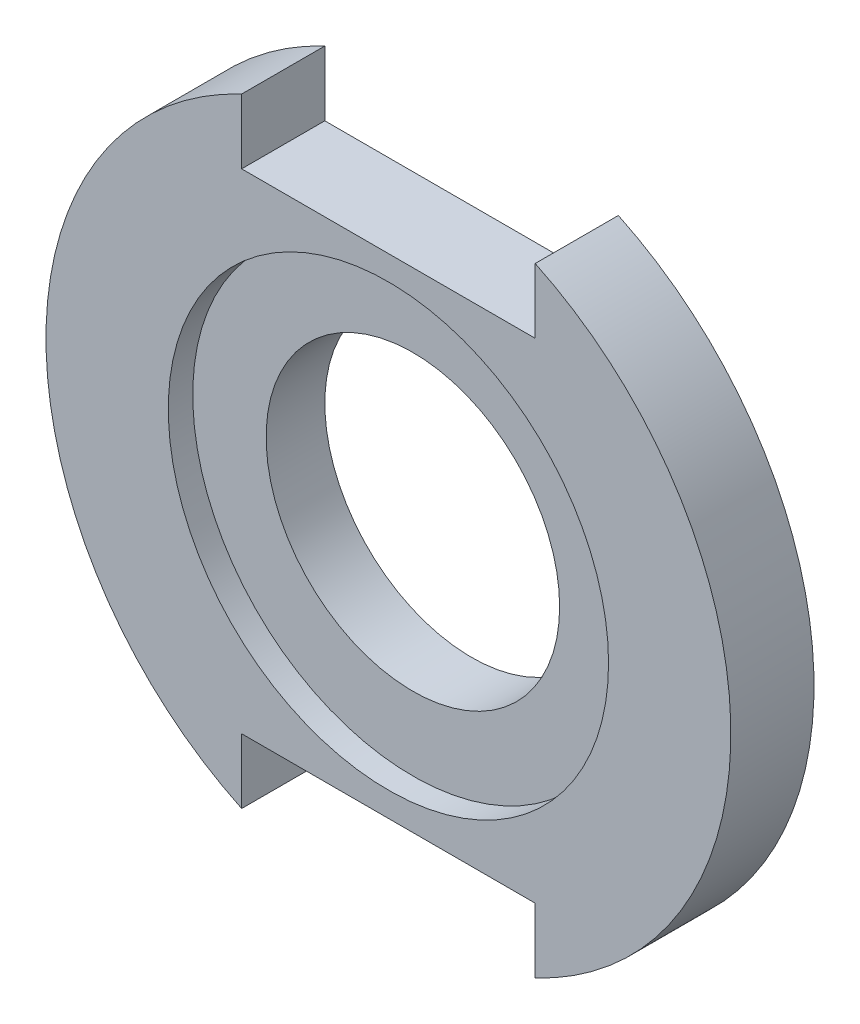
ISO-10303-21;
HEADER;
FILE_DESCRIPTION(('STEP AP214'),'2;1');
FILE_NAME('part.step','',(''),(''),'','','');
FILE_SCHEMA(('AUTOMOTIVE_DESIGN { 1 0 10303 214 1 1 1 1 }'));
ENDSEC;
DATA;
#1=APPLICATION_CONTEXT('core data for automotive mechanical design processes');
#2=APPLICATION_PROTOCOL_DEFINITION('international standard','automotive_design',2000,#1);
#3=PRODUCT_CONTEXT('',#1,'mechanical');
#4=PRODUCT('Part','Part','',(#3));
#5=PRODUCT_RELATED_PRODUCT_CATEGORY('part','',(#4));
#6=PRODUCT_DEFINITION_FORMATION('','',#4);
#7=PRODUCT_DEFINITION_CONTEXT('part definition',#1,'design');
#8=PRODUCT_DEFINITION('design','',#6,#7);
#9=PRODUCT_DEFINITION_SHAPE('','',#8);
#10=(LENGTH_UNIT() NAMED_UNIT(*) SI_UNIT(.MILLI.,.METRE.));
#11=(NAMED_UNIT(*) PLANE_ANGLE_UNIT() SI_UNIT($,.RADIAN.));
#12=(NAMED_UNIT(*) SI_UNIT($,.STERADIAN.) SOLID_ANGLE_UNIT());
#13=UNCERTAINTY_MEASURE_WITH_UNIT(LENGTH_MEASURE(1.E-05),#10,'distance_accuracy_value','');
#14=(GEOMETRIC_REPRESENTATION_CONTEXT(3) GLOBAL_UNCERTAINTY_ASSIGNED_CONTEXT((#13)) GLOBAL_UNIT_ASSIGNED_CONTEXT((#10,
#11,#12)) REPRESENTATION_CONTEXT('',''));
#15=CARTESIAN_POINT('',(0.,0.,0.));
#16=DIRECTION('',(0.,0.,1.));
#17=DIRECTION('',(1.,0.,0.));
#18=AXIS2_PLACEMENT_3D('',#15,#16,#17);
#19=CARTESIAN_POINT('',(0.,0.,0.));
#20=DIRECTION('',(0.,0.,1.));
#21=DIRECTION('',(1.,0.,0.));
#22=AXIS2_PLACEMENT_3D('',#19,#20,#21);
#23=CYLINDRICAL_SURFACE('',#22,6.);
#24=CARTESIAN_POINT('',(0.,0.,0.));
#25=DIRECTION('',(0.,0.,1.));
#26=DIRECTION('',(1.,0.,0.));
#27=AXIS2_PLACEMENT_3D('',#24,#25,#26);
#28=CIRCLE('',#27,6.);
#29=CARTESIAN_POINT('',(6.,0.,0.));
#30=VERTEX_POINT('',#29);
#31=EDGE_CURVE('E161',#30,#30,#28,.T.);
#32=ORIENTED_EDGE('',*,*,#31,.F.);
#33=EDGE_LOOP('',(#32));
#34=FACE_BOUND('',#33,.T.);
#35=CARTESIAN_POINT('',(0.,0.,2.4));
#36=DIRECTION('',(0.,0.,1.));
#37=DIRECTION('',(1.,0.,0.));
#38=AXIS2_PLACEMENT_3D('',#35,#36,#37);
#39=CIRCLE('',#38,6.);
#40=CARTESIAN_POINT('',(6.,0.,2.4));
#41=VERTEX_POINT('',#40);
#42=EDGE_CURVE('E44',#41,#41,#39,.F.);
#43=ORIENTED_EDGE('',*,*,#42,.F.);
#44=EDGE_LOOP('',(#43));
#45=FACE_BOUND('',#44,.T.);
#46=ADVANCED_FACE('F40',(#34,#45),#23,.F.);
#47=CARTESIAN_POINT('',(0.,0.,3.4));
#48=DIRECTION('',(0.,0.,-1.));
#49=DIRECTION('',(-1.,0.,0.));
#50=AXIS2_PLACEMENT_3D('',#47,#48,#49);
#51=CYLINDRICAL_SURFACE('',#50,14.);
#52=CARTESIAN_POINT('',(0.,0.,0.));
#53=DIRECTION('',(0.,0.,1.));
#54=DIRECTION('',(1.,0.,0.));
#55=AXIS2_PLACEMENT_3D('',#52,#53,#54);
#56=CIRCLE('',#55,14.);
#57=CARTESIAN_POINT('',(6.,-12.6491106406735,0.));
#58=VERTEX_POINT('',#57);
#59=CARTESIAN_POINT('',(6.,12.6491106406735,0.));
#60=VERTEX_POINT('',#59);
#61=EDGE_CURVE('E164',#58,#60,#56,.T.);
#62=ORIENTED_EDGE('',*,*,#61,.T.);
#63=DIRECTION('',(0.,0.,-1.));
#64=VECTOR('',#63,1.);
#65=CARTESIAN_POINT('',(6.,12.6491106406735,3.4));
#66=LINE('',#65,#64);
#67=CARTESIAN_POINT('',(6.,12.6491106406735,3.4));
#68=VERTEX_POINT('',#67);
#69=EDGE_CURVE('E119',#60,#68,#66,.F.);
#70=ORIENTED_EDGE('',*,*,#69,.T.);
#71=CARTESIAN_POINT('',(0.,0.,3.4));
#72=DIRECTION('',(0.,0.,1.));
#73=DIRECTION('',(1.,0.,0.));
#74=AXIS2_PLACEMENT_3D('',#71,#72,#73);
#75=CIRCLE('',#74,14.);
#76=CARTESIAN_POINT('',(6.,-12.6491106406735,3.4));
#77=VERTEX_POINT('',#76);
#78=EDGE_CURVE('E165',#77,#68,#75,.T.);
#79=ORIENTED_EDGE('',*,*,#78,.F.);
#80=DIRECTION('',(0.,0.,-1.));
#81=VECTOR('',#80,1.);
#82=CARTESIAN_POINT('',(6.,-12.6491106406735,3.4));
#83=LINE('',#82,#81);
#84=EDGE_CURVE('E154',#77,#58,#83,.T.);
#85=ORIENTED_EDGE('',*,*,#84,.T.);
#86=EDGE_LOOP('',(#62,#70,#79,#85));
#87=FACE_BOUND('',#86,.T.);
#88=ADVANCED_FACE('F189',(#87),#51,.T.);
#89=CARTESIAN_POINT('',(-6.,12.6491106406735,3.4));
#90=VERTEX_POINT('',#89);
#91=CARTESIAN_POINT('',(-6.,-12.6491106406735,3.4));
#92=VERTEX_POINT('',#91);
#93=EDGE_CURVE('E168',#90,#92,#75,.T.);
#94=ORIENTED_EDGE('',*,*,#93,.F.);
#95=DIRECTION('',(0.,0.,-1.));
#96=VECTOR('',#95,1.);
#97=CARTESIAN_POINT('',(-6.,12.6491106406735,3.4));
#98=LINE('',#97,#96);
#99=CARTESIAN_POINT('',(-6.,12.6491106406735,0.));
#100=VERTEX_POINT('',#99);
#101=EDGE_CURVE('E157',#90,#100,#98,.T.);
#102=ORIENTED_EDGE('',*,*,#101,.T.);
#103=CARTESIAN_POINT('',(-6.,-12.6491106406735,0.));
#104=VERTEX_POINT('',#103);
#105=EDGE_CURVE('E169',#100,#104,#56,.T.);
#106=ORIENTED_EDGE('',*,*,#105,.T.);
#107=DIRECTION('',(0.,0.,-1.));
#108=VECTOR('',#107,1.);
#109=CARTESIAN_POINT('',(-6.,-12.6491106406735,3.4));
#110=LINE('',#109,#108);
#111=EDGE_CURVE('E112',#104,#92,#110,.F.);
#112=ORIENTED_EDGE('',*,*,#111,.T.);
#113=EDGE_LOOP('',(#94,#102,#106,#112));
#114=FACE_BOUND('',#113,.T.);
#115=ADVANCED_FACE('F42',(#114),#51,.T.);
#116=CARTESIAN_POINT('',(0.,0.,3.4));
#117=DIRECTION('',(0.,0.,1.));
#118=DIRECTION('',(1.,0.,0.));
#119=AXIS2_PLACEMENT_3D('',#116,#117,#118);
#120=PLANE('',#119);
#121=CARTESIAN_POINT('',(0.,0.,3.4));
#122=DIRECTION('',(0.,0.,1.));
#123=DIRECTION('',(1.,0.,0.));
#124=AXIS2_PLACEMENT_3D('',#121,#122,#123);
#125=CIRCLE('',#124,9.);
#126=CARTESIAN_POINT('',(9.,0.,3.4));
#127=VERTEX_POINT('',#126);
#128=EDGE_CURVE('E218',#127,#127,#125,.T.);
#129=ORIENTED_EDGE('',*,*,#128,.F.);
#130=EDGE_LOOP('',(#129));
#131=FACE_BOUND('',#130,.T.);
#132=DIRECTION('',(0.,1.,0.));
#133=VECTOR('',#132,1.);
#134=CARTESIAN_POINT('',(6.,18.,3.4));
#135=LINE('',#134,#133);
#136=CARTESIAN_POINT('',(6.,10.,3.4));
#137=VERTEX_POINT('',#136);
#138=EDGE_CURVE('E131',#137,#68,#135,.T.);
#139=ORIENTED_EDGE('',*,*,#138,.F.);
#140=DIRECTION('',(1.,0.,0.));
#141=VECTOR('',#140,1.);
#142=CARTESIAN_POINT('',(-6.,10.,3.4));
#143=LINE('',#142,#141);
#144=CARTESIAN_POINT('',(-6.,10.,3.4));
#145=VERTEX_POINT('',#144);
#146=EDGE_CURVE('E109',#145,#137,#143,.T.);
#147=ORIENTED_EDGE('',*,*,#146,.F.);
#148=DIRECTION('',(0.,-1.,0.));
#149=VECTOR('',#148,1.);
#150=CARTESIAN_POINT('',(-6.,18.,3.4));
#151=LINE('',#150,#149);
#152=EDGE_CURVE('E133',#90,#145,#151,.T.);
#153=ORIENTED_EDGE('',*,*,#152,.F.);
#154=ORIENTED_EDGE('',*,*,#93,.T.);
#155=DIRECTION('',(0.,-1.,0.));
#156=VECTOR('',#155,1.);
#157=CARTESIAN_POINT('',(-6.,-18.,3.4));
#158=LINE('',#157,#156);
#159=CARTESIAN_POINT('',(-6.,-10.,3.4));
#160=VERTEX_POINT('',#159);
#161=EDGE_CURVE('E142',#160,#92,#158,.T.);
#162=ORIENTED_EDGE('',*,*,#161,.F.);
#163=DIRECTION('',(-1.,0.,0.));
#164=VECTOR('',#163,1.);
#165=CARTESIAN_POINT('',(-6.,-10.,3.4));
#166=LINE('',#165,#164);
#167=CARTESIAN_POINT('',(6.,-10.,3.4));
#168=VERTEX_POINT('',#167);
#169=EDGE_CURVE('E144',#168,#160,#166,.T.);
#170=ORIENTED_EDGE('',*,*,#169,.F.);
#171=DIRECTION('',(0.,1.,0.));
#172=VECTOR('',#171,1.);
#173=CARTESIAN_POINT('',(6.,-18.,3.4));
#174=LINE('',#173,#172);
#175=EDGE_CURVE('E134',#77,#168,#174,.T.);
#176=ORIENTED_EDGE('',*,*,#175,.F.);
#177=ORIENTED_EDGE('',*,*,#78,.T.);
#178=EDGE_LOOP('',(#139,#147,#153,#154,#162,#170,#176,#177));
#179=FACE_BOUND('',#178,.T.);
#180=ADVANCED_FACE('F177',(#131,#179),#120,.T.);
#181=CARTESIAN_POINT('',(0.,0.,0.));
#182=DIRECTION('',(0.,0.,1.));
#183=DIRECTION('',(1.,0.,0.));
#184=AXIS2_PLACEMENT_3D('',#181,#182,#183);
#185=PLANE('',#184);
#186=DIRECTION('',(1.,0.,0.));
#187=VECTOR('',#186,1.);
#188=CARTESIAN_POINT('',(-6.,10.,0.));
#189=LINE('',#188,#187);
#190=CARTESIAN_POINT('',(-6.,10.,0.));
#191=VERTEX_POINT('',#190);
#192=CARTESIAN_POINT('',(6.,10.,0.));
#193=VERTEX_POINT('',#192);
#194=EDGE_CURVE('E56',#191,#193,#189,.T.);
#195=ORIENTED_EDGE('',*,*,#194,.T.);
#196=DIRECTION('',(0.,1.,0.));
#197=VECTOR('',#196,1.);
#198=CARTESIAN_POINT('',(6.,18.,0.));
#199=LINE('',#198,#197);
#200=EDGE_CURVE('E116',#193,#60,#199,.T.);
#201=ORIENTED_EDGE('',*,*,#200,.T.);
#202=ORIENTED_EDGE('',*,*,#61,.F.);
#203=DIRECTION('',(0.,1.,0.));
#204=VECTOR('',#203,1.);
#205=CARTESIAN_POINT('',(6.,0.,0.));
#206=LINE('',#205,#204);
#207=CARTESIAN_POINT('',(6.,-10.,0.));
#208=VERTEX_POINT('',#207);
#209=EDGE_CURVE('E49',#58,#208,#206,.T.);
#210=ORIENTED_EDGE('',*,*,#209,.T.);
#211=DIRECTION('',(-1.,0.,0.));
#212=VECTOR('',#211,1.);
#213=CARTESIAN_POINT('',(-6.,-10.,0.));
#214=LINE('',#213,#212);
#215=CARTESIAN_POINT('',(-6.,-10.,0.));
#216=VERTEX_POINT('',#215);
#217=EDGE_CURVE('E145',#208,#216,#214,.T.);
#218=ORIENTED_EDGE('',*,*,#217,.T.);
#219=DIRECTION('',(0.,-1.,0.));
#220=VECTOR('',#219,1.);
#221=CARTESIAN_POINT('',(-6.,-18.,0.));
#222=LINE('',#221,#220);
#223=EDGE_CURVE('E64',#216,#104,#222,.T.);
#224=ORIENTED_EDGE('',*,*,#223,.T.);
#225=ORIENTED_EDGE('',*,*,#105,.F.);
#226=DIRECTION('',(0.,-1.,0.));
#227=VECTOR('',#226,1.);
#228=CARTESIAN_POINT('',(-6.,0.,0.));
#229=LINE('',#228,#227);
#230=EDGE_CURVE('E11',#100,#191,#229,.T.);
#231=ORIENTED_EDGE('',*,*,#230,.T.);
#232=EDGE_LOOP('',(#195,#201,#202,#210,#218,#224,#225,#231));
#233=FACE_BOUND('',#232,.T.);
#234=ORIENTED_EDGE('',*,*,#31,.T.);
#235=EDGE_LOOP('',(#234));
#236=FACE_BOUND('',#235,.T.);
#237=ADVANCED_FACE('F124',(#233,#236),#185,.F.);
#238=CARTESIAN_POINT('',(6.,-18.,0.));
#239=DIRECTION('',(1.,0.,0.));
#240=DIRECTION('',(0.,0.,-1.));
#241=AXIS2_PLACEMENT_3D('',#238,#239,#240);
#242=PLANE('',#241);
#243=ORIENTED_EDGE('',*,*,#175,.T.);
#244=DIRECTION('',(0.,0.,1.));
#245=VECTOR('',#244,1.);
#246=CARTESIAN_POINT('',(6.,-10.,0.));
#247=LINE('',#246,#245);
#248=EDGE_CURVE('E137',#208,#168,#247,.T.);
#249=ORIENTED_EDGE('',*,*,#248,.F.);
#250=ORIENTED_EDGE('',*,*,#209,.F.);
#251=ORIENTED_EDGE('',*,*,#84,.F.);
#252=EDGE_LOOP('',(#243,#249,#250,#251));
#253=FACE_BOUND('',#252,.T.);
#254=ADVANCED_FACE('F190',(#253),#242,.F.);
#255=CARTESIAN_POINT('',(-6.,-18.,0.));
#256=DIRECTION('',(-1.,0.,0.));
#257=DIRECTION('',(0.,0.,1.));
#258=AXIS2_PLACEMENT_3D('',#255,#256,#257);
#259=PLANE('',#258);
#260=ORIENTED_EDGE('',*,*,#223,.F.);
#261=DIRECTION('',(0.,0.,1.));
#262=VECTOR('',#261,1.);
#263=CARTESIAN_POINT('',(-6.,-10.,0.));
#264=LINE('',#263,#262);
#265=EDGE_CURVE('E140',#216,#160,#264,.T.);
#266=ORIENTED_EDGE('',*,*,#265,.T.);
#267=ORIENTED_EDGE('',*,*,#161,.T.);
#268=ORIENTED_EDGE('',*,*,#111,.F.);
#269=EDGE_LOOP('',(#260,#266,#267,#268));
#270=FACE_BOUND('',#269,.T.);
#271=ADVANCED_FACE('F181',(#270),#259,.F.);
#272=CARTESIAN_POINT('',(-6.,-10.,0.));
#273=DIRECTION('',(0.,1.,0.));
#274=DIRECTION('',(0.,0.,1.));
#275=AXIS2_PLACEMENT_3D('',#272,#273,#274);
#276=PLANE('',#275);
#277=ORIENTED_EDGE('',*,*,#169,.T.);
#278=ORIENTED_EDGE('',*,*,#265,.F.);
#279=ORIENTED_EDGE('',*,*,#217,.F.);
#280=ORIENTED_EDGE('',*,*,#248,.T.);
#281=EDGE_LOOP('',(#277,#278,#279,#280));
#282=FACE_BOUND('',#281,.T.);
#283=ADVANCED_FACE('F184',(#282),#276,.F.);
#284=CARTESIAN_POINT('',(6.,18.,0.));
#285=DIRECTION('',(1.,0.,0.));
#286=DIRECTION('',(0.,1.,0.));
#287=AXIS2_PLACEMENT_3D('',#284,#285,#286);
#288=PLANE('',#287);
#289=ORIENTED_EDGE('',*,*,#200,.F.);
#290=DIRECTION('',(0.,0.,1.));
#291=VECTOR('',#290,1.);
#292=CARTESIAN_POINT('',(6.,10.,0.));
#293=LINE('',#292,#291);
#294=EDGE_CURVE('E105',#193,#137,#293,.T.);
#295=ORIENTED_EDGE('',*,*,#294,.T.);
#296=ORIENTED_EDGE('',*,*,#138,.T.);
#297=ORIENTED_EDGE('',*,*,#69,.F.);
#298=EDGE_LOOP('',(#289,#295,#296,#297));
#299=FACE_BOUND('',#298,.T.);
#300=ADVANCED_FACE('F117',(#299),#288,.F.);
#301=CARTESIAN_POINT('',(-6.,18.,0.));
#302=DIRECTION('',(-1.,0.,0.));
#303=DIRECTION('',(0.,-1.,0.));
#304=AXIS2_PLACEMENT_3D('',#301,#302,#303);
#305=PLANE('',#304);
#306=ORIENTED_EDGE('',*,*,#152,.T.);
#307=DIRECTION('',(0.,0.,1.));
#308=VECTOR('',#307,1.);
#309=CARTESIAN_POINT('',(-6.,10.,0.));
#310=LINE('',#309,#308);
#311=EDGE_CURVE('E113',#191,#145,#310,.T.);
#312=ORIENTED_EDGE('',*,*,#311,.F.);
#313=ORIENTED_EDGE('',*,*,#230,.F.);
#314=ORIENTED_EDGE('',*,*,#101,.F.);
#315=EDGE_LOOP('',(#306,#312,#313,#314));
#316=FACE_BOUND('',#315,.T.);
#317=ADVANCED_FACE('F238',(#316),#305,.F.);
#318=CARTESIAN_POINT('',(-6.,10.,0.));
#319=DIRECTION('',(0.,-1.,0.));
#320=DIRECTION('',(0.,0.,-1.));
#321=AXIS2_PLACEMENT_3D('',#318,#319,#320);
#322=PLANE('',#321);
#323=ORIENTED_EDGE('',*,*,#146,.T.);
#324=ORIENTED_EDGE('',*,*,#294,.F.);
#325=ORIENTED_EDGE('',*,*,#194,.F.);
#326=ORIENTED_EDGE('',*,*,#311,.T.);
#327=EDGE_LOOP('',(#323,#324,#325,#326));
#328=FACE_BOUND('',#327,.T.);
#329=ADVANCED_FACE('F107',(#328),#322,.F.);
#330=CARTESIAN_POINT('',(0.,0.,2.4));
#331=DIRECTION('',(0.,0.,1.));
#332=DIRECTION('',(1.,0.,0.));
#333=AXIS2_PLACEMENT_3D('',#330,#331,#332);
#334=PLANE('',#333);
#335=CARTESIAN_POINT('',(0.,0.,2.4));
#336=DIRECTION('',(0.,0.,1.));
#337=DIRECTION('',(1.,0.,0.));
#338=AXIS2_PLACEMENT_3D('',#335,#336,#337);
#339=CIRCLE('',#338,9.);
#340=CARTESIAN_POINT('',(9.,0.,2.4));
#341=VERTEX_POINT('',#340);
#342=EDGE_CURVE('E220',#341,#341,#339,.T.);
#343=ORIENTED_EDGE('',*,*,#342,.T.);
#344=EDGE_LOOP('',(#343));
#345=FACE_BOUND('',#344,.T.);
#346=ORIENTED_EDGE('',*,*,#42,.T.);
#347=EDGE_LOOP('',(#346));
#348=FACE_BOUND('',#347,.T.);
#349=ADVANCED_FACE('F228',(#345,#348),#334,.T.);
#350=CARTESIAN_POINT('',(0.,0.,2.4));
#351=DIRECTION('',(0.,0.,1.));
#352=DIRECTION('',(1.,0.,0.));
#353=AXIS2_PLACEMENT_3D('',#350,#351,#352);
#354=CYLINDRICAL_SURFACE('',#353,9.);
#355=ORIENTED_EDGE('',*,*,#342,.F.);
#356=EDGE_LOOP('',(#355));
#357=FACE_BOUND('',#356,.T.);
#358=ORIENTED_EDGE('',*,*,#128,.T.);
#359=EDGE_LOOP('',(#358));
#360=FACE_BOUND('',#359,.T.);
#361=ADVANCED_FACE('F230',(#357,#360),#354,.F.);
#362=CLOSED_SHELL('',(#46,#88,#115,#180,#237,#254,#271,#283,#300,#317,#329,#349,#361));
#363=MANIFOLD_SOLID_BREP('B2',#362);
#364=ADVANCED_BREP_SHAPE_REPRESENTATION('',(#18,#363),#14);
#365=SHAPE_DEFINITION_REPRESENTATION(#9,#364);
ENDSEC;
END-ISO-10303-21;
